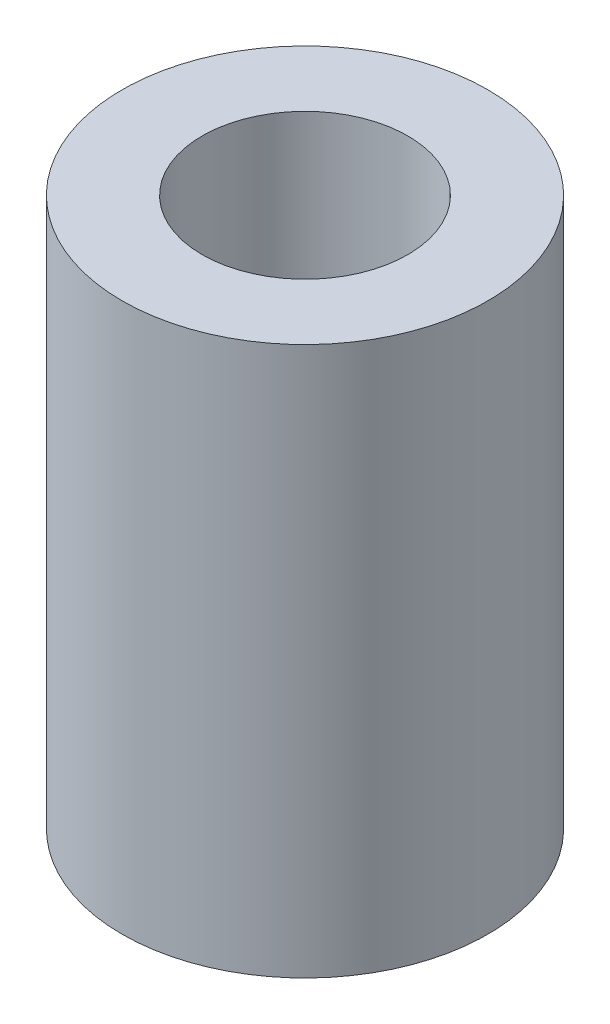
ISO-10303-21;
HEADER;
FILE_DESCRIPTION(('STEP AP214'),'2;1');
FILE_NAME('part.step','',(''),(''),'','','');
FILE_SCHEMA(('AUTOMOTIVE_DESIGN { 1 0 10303 214 1 1 1 1 }'));
ENDSEC;
DATA;
#1=APPLICATION_CONTEXT('core data for automotive mechanical design processes');
#2=APPLICATION_PROTOCOL_DEFINITION('international standard','automotive_design',2000,#1);
#3=PRODUCT_CONTEXT('',#1,'mechanical');
#4=PRODUCT('Part','Part','',(#3));
#5=PRODUCT_RELATED_PRODUCT_CATEGORY('part','',(#4));
#6=PRODUCT_DEFINITION_FORMATION('','',#4);
#7=PRODUCT_DEFINITION_CONTEXT('part definition',#1,'design');
#8=PRODUCT_DEFINITION('design','',#6,#7);
#9=PRODUCT_DEFINITION_SHAPE('','',#8);
#10=(LENGTH_UNIT() NAMED_UNIT(*) SI_UNIT(.MILLI.,.METRE.));
#11=(NAMED_UNIT(*) PLANE_ANGLE_UNIT() SI_UNIT($,.RADIAN.));
#12=(NAMED_UNIT(*) SI_UNIT($,.STERADIAN.) SOLID_ANGLE_UNIT());
#13=UNCERTAINTY_MEASURE_WITH_UNIT(LENGTH_MEASURE(1.E-05),#10,'distance_accuracy_value','');
#14=(GEOMETRIC_REPRESENTATION_CONTEXT(3) GLOBAL_UNCERTAINTY_ASSIGNED_CONTEXT((#13)) GLOBAL_UNIT_ASSIGNED_CONTEXT((#10,
#11,#12)) REPRESENTATION_CONTEXT('',''));
#15=CARTESIAN_POINT('',(0.,0.,0.));
#16=DIRECTION('',(0.,0.,1.));
#17=DIRECTION('',(1.,0.,0.));
#18=AXIS2_PLACEMENT_3D('',#15,#16,#17);
#19=CARTESIAN_POINT('',(0.,12.,0.));
#20=DIRECTION('',(0.,1.,0.));
#21=DIRECTION('',(0.,0.,1.));
#22=AXIS2_PLACEMENT_3D('',#19,#20,#21);
#23=PLANE('',#22);
#24=CARTESIAN_POINT('',(0.,12.,0.));
#25=DIRECTION('',(0.,1.,0.));
#26=DIRECTION('',(0.,0.,1.));
#27=AXIS2_PLACEMENT_3D('',#24,#25,#26);
#28=CIRCLE('',#27,4.);
#29=CARTESIAN_POINT('',(0.,12.,4.));
#30=VERTEX_POINT('',#29);
#31=EDGE_CURVE('E10',#30,#30,#28,.T.);
#32=ORIENTED_EDGE('',*,*,#31,.T.);
#33=EDGE_LOOP('',(#32));
#34=FACE_BOUND('',#33,.T.);
#35=CARTESIAN_POINT('',(0.,12.,0.));
#36=DIRECTION('',(0.,1.,0.));
#37=DIRECTION('',(0.,0.,1.));
#38=AXIS2_PLACEMENT_3D('',#35,#36,#37);
#39=CIRCLE('',#38,2.25);
#40=CARTESIAN_POINT('',(0.,12.,2.25));
#41=VERTEX_POINT('',#40);
#42=EDGE_CURVE('E44',#41,#41,#39,.T.);
#43=ORIENTED_EDGE('',*,*,#42,.F.);
#44=EDGE_LOOP('',(#43));
#45=FACE_BOUND('',#44,.T.);
#46=ADVANCED_FACE('F33',(#34,#45),#23,.T.);
#47=CARTESIAN_POINT('',(0.,0.,0.));
#48=DIRECTION('',(0.,1.,0.));
#49=DIRECTION('',(0.,0.,1.));
#50=AXIS2_PLACEMENT_3D('',#47,#48,#49);
#51=PLANE('',#50);
#52=CARTESIAN_POINT('',(0.,0.,0.));
#53=DIRECTION('',(0.,1.,0.));
#54=DIRECTION('',(0.,0.,1.));
#55=AXIS2_PLACEMENT_3D('',#52,#53,#54);
#56=CIRCLE('',#55,4.);
#57=CARTESIAN_POINT('',(0.,0.,4.));
#58=VERTEX_POINT('',#57);
#59=EDGE_CURVE('E37',#58,#58,#56,.T.);
#60=ORIENTED_EDGE('',*,*,#59,.F.);
#61=EDGE_LOOP('',(#60));
#62=FACE_BOUND('',#61,.T.);
#63=CARTESIAN_POINT('',(0.,0.,0.));
#64=DIRECTION('',(0.,1.,0.));
#65=DIRECTION('',(0.,0.,1.));
#66=AXIS2_PLACEMENT_3D('',#63,#64,#65);
#67=CIRCLE('',#66,2.25);
#68=CARTESIAN_POINT('',(0.,0.,2.25));
#69=VERTEX_POINT('',#68);
#70=EDGE_CURVE('E46',#69,#69,#67,.T.);
#71=ORIENTED_EDGE('',*,*,#70,.T.);
#72=EDGE_LOOP('',(#71));
#73=FACE_BOUND('',#72,.T.);
#74=ADVANCED_FACE('F56',(#62,#73),#51,.F.);
#75=CARTESIAN_POINT('',(0.,12.,0.));
#76=DIRECTION('',(0.,-1.,0.));
#77=DIRECTION('',(0.,0.,-1.));
#78=AXIS2_PLACEMENT_3D('',#75,#76,#77);
#79=CYLINDRICAL_SURFACE('',#78,4.);
#80=ORIENTED_EDGE('',*,*,#31,.F.);
#81=EDGE_LOOP('',(#80));
#82=FACE_BOUND('',#81,.T.);
#83=ORIENTED_EDGE('',*,*,#59,.T.);
#84=EDGE_LOOP('',(#83));
#85=FACE_BOUND('',#84,.T.);
#86=ADVANCED_FACE('F35',(#82,#85),#79,.T.);
#87=CARTESIAN_POINT('',(0.,12.,0.));
#88=DIRECTION('',(0.,-1.,0.));
#89=DIRECTION('',(0.,0.,-1.));
#90=AXIS2_PLACEMENT_3D('',#87,#88,#89);
#91=CYLINDRICAL_SURFACE('',#90,2.25);
#92=ORIENTED_EDGE('',*,*,#42,.T.);
#93=EDGE_LOOP('',(#92));
#94=FACE_BOUND('',#93,.T.);
#95=ORIENTED_EDGE('',*,*,#70,.F.);
#96=EDGE_LOOP('',(#95));
#97=FACE_BOUND('',#96,.T.);
#98=ADVANCED_FACE('F52',(#94,#97),#91,.F.);
#99=CLOSED_SHELL('',(#46,#74,#86,#98));
#100=MANIFOLD_SOLID_BREP('B2',#99);
#101=ADVANCED_BREP_SHAPE_REPRESENTATION('',(#18,#100),#14);
#102=SHAPE_DEFINITION_REPRESENTATION(#9,#101);
ENDSEC;
END-ISO-10303-21;
